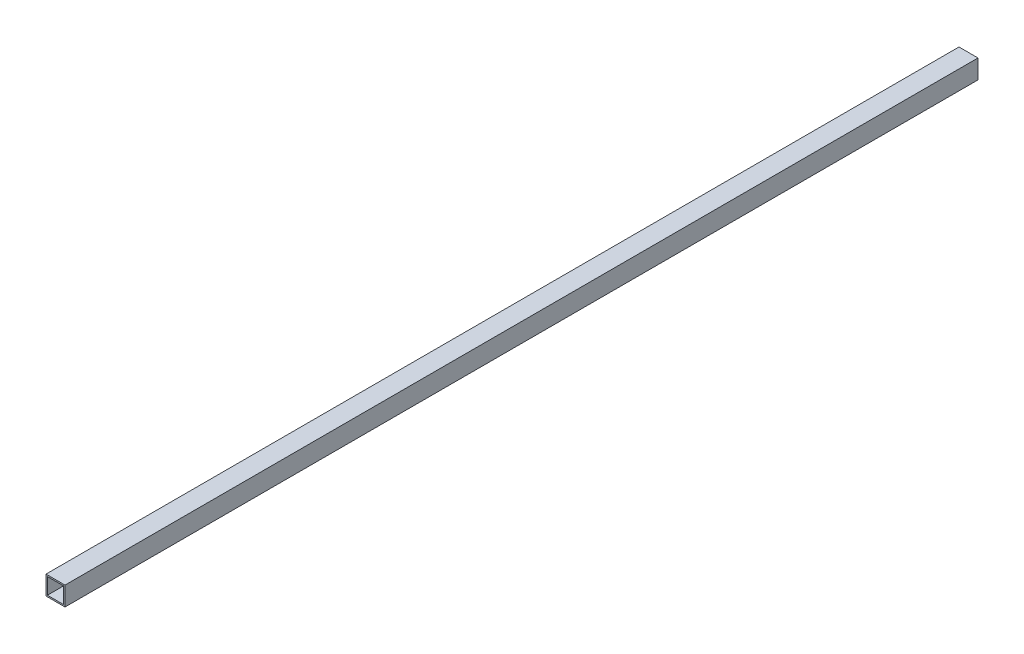
ISO-10303-21;
HEADER;
FILE_DESCRIPTION(('STEP AP214'),'2;1');
FILE_NAME('part.step','',(''),(''),'','','');
FILE_SCHEMA(('AUTOMOTIVE_DESIGN { 1 0 10303 214 1 1 1 1 }'));
ENDSEC;
DATA;
#1=APPLICATION_CONTEXT('core data for automotive mechanical design processes');
#2=APPLICATION_PROTOCOL_DEFINITION('international standard','automotive_design',2000,#1);
#3=PRODUCT_CONTEXT('',#1,'mechanical');
#4=PRODUCT('Part','Part','',(#3));
#5=PRODUCT_RELATED_PRODUCT_CATEGORY('part','',(#4));
#6=PRODUCT_DEFINITION_FORMATION('','',#4);
#7=PRODUCT_DEFINITION_CONTEXT('part definition',#1,'design');
#8=PRODUCT_DEFINITION('design','',#6,#7);
#9=PRODUCT_DEFINITION_SHAPE('','',#8);
#10=(LENGTH_UNIT() NAMED_UNIT(*) SI_UNIT(.MILLI.,.METRE.));
#11=(NAMED_UNIT(*) PLANE_ANGLE_UNIT() SI_UNIT($,.RADIAN.));
#12=(NAMED_UNIT(*) SI_UNIT($,.STERADIAN.) SOLID_ANGLE_UNIT());
#13=UNCERTAINTY_MEASURE_WITH_UNIT(LENGTH_MEASURE(1.E-05),#10,'distance_accuracy_value','');
#14=(GEOMETRIC_REPRESENTATION_CONTEXT(3) GLOBAL_UNCERTAINTY_ASSIGNED_CONTEXT((#13)) GLOBAL_UNIT_ASSIGNED_CONTEXT((#10,
#11,#12)) REPRESENTATION_CONTEXT('',''));
#15=CARTESIAN_POINT('',(0.,0.,0.));
#16=DIRECTION('',(0.,0.,1.));
#17=DIRECTION('',(1.,0.,0.));
#18=AXIS2_PLACEMENT_3D('',#15,#16,#17);
#19=CARTESIAN_POINT('',(20.,20.,1920.));
#20=DIRECTION('',(-1.,0.,0.));
#21=DIRECTION('',(0.,-1.,0.));
#22=AXIS2_PLACEMENT_3D('',#19,#20,#21);
#23=PLANE('',#22);
#24=DIRECTION('',(0.,1.,0.));
#25=VECTOR('',#24,1.);
#26=CARTESIAN_POINT('',(20.,20.,0.));
#27=LINE('',#26,#25);
#28=CARTESIAN_POINT('',(20.,-20.,0.));
#29=VERTEX_POINT('',#28);
#30=CARTESIAN_POINT('',(20.,20.,0.));
#31=VERTEX_POINT('',#30);
#32=EDGE_CURVE('E131',#29,#31,#27,.T.);
#33=ORIENTED_EDGE('',*,*,#32,.T.);
#34=DIRECTION('',(0.,0.,-1.));
#35=VECTOR('',#34,1.);
#36=CARTESIAN_POINT('',(20.,20.,1920.));
#37=LINE('',#36,#35);
#38=CARTESIAN_POINT('',(20.,20.,1920.));
#39=VERTEX_POINT('',#38);
#40=EDGE_CURVE('E11',#39,#31,#37,.T.);
#41=ORIENTED_EDGE('',*,*,#40,.F.);
#42=DIRECTION('',(0.,1.,0.));
#43=VECTOR('',#42,1.);
#44=CARTESIAN_POINT('',(20.,20.,1920.));
#45=LINE('',#44,#43);
#46=CARTESIAN_POINT('',(20.,-20.,1920.));
#47=VERTEX_POINT('',#46);
#48=EDGE_CURVE('E135',#47,#39,#45,.T.);
#49=ORIENTED_EDGE('',*,*,#48,.F.);
#50=DIRECTION('',(0.,0.,-1.));
#51=VECTOR('',#50,1.);
#52=CARTESIAN_POINT('',(20.,-20.,1920.));
#53=LINE('',#52,#51);
#54=EDGE_CURVE('E145',#47,#29,#53,.T.);
#55=ORIENTED_EDGE('',*,*,#54,.T.);
#56=EDGE_LOOP('',(#33,#41,#49,#55));
#57=FACE_BOUND('',#56,.T.);
#58=ADVANCED_FACE('F34',(#57),#23,.F.);
#59=CARTESIAN_POINT('',(-20.,20.,1920.));
#60=DIRECTION('',(0.,-1.,0.));
#61=DIRECTION('',(0.,0.,-1.));
#62=AXIS2_PLACEMENT_3D('',#59,#60,#61);
#63=PLANE('',#62);
#64=DIRECTION('',(-1.,0.,0.));
#65=VECTOR('',#64,1.);
#66=CARTESIAN_POINT('',(-20.,20.,0.));
#67=LINE('',#66,#65);
#68=CARTESIAN_POINT('',(-20.,20.,0.));
#69=VERTEX_POINT('',#68);
#70=EDGE_CURVE('E148',#31,#69,#67,.T.);
#71=ORIENTED_EDGE('',*,*,#70,.T.);
#72=DIRECTION('',(0.,0.,-1.));
#73=VECTOR('',#72,1.);
#74=CARTESIAN_POINT('',(-20.,20.,1920.));
#75=LINE('',#74,#73);
#76=CARTESIAN_POINT('',(-20.,20.,1920.));
#77=VERTEX_POINT('',#76);
#78=EDGE_CURVE('E41',#77,#69,#75,.T.);
#79=ORIENTED_EDGE('',*,*,#78,.F.);
#80=DIRECTION('',(-1.,0.,0.));
#81=VECTOR('',#80,1.);
#82=CARTESIAN_POINT('',(-20.,20.,1920.));
#83=LINE('',#82,#81);
#84=EDGE_CURVE('E138',#39,#77,#83,.T.);
#85=ORIENTED_EDGE('',*,*,#84,.F.);
#86=ORIENTED_EDGE('',*,*,#40,.T.);
#87=EDGE_LOOP('',(#71,#79,#85,#86));
#88=FACE_BOUND('',#87,.T.);
#89=ADVANCED_FACE('F176',(#88),#63,.F.);
#90=CARTESIAN_POINT('',(-20.,20.,1920.));
#91=DIRECTION('',(1.,0.,0.));
#92=DIRECTION('',(0.,0.,-1.));
#93=AXIS2_PLACEMENT_3D('',#90,#91,#92);
#94=PLANE('',#93);
#95=DIRECTION('',(0.,-1.,0.));
#96=VECTOR('',#95,1.);
#97=CARTESIAN_POINT('',(-20.,20.,0.));
#98=LINE('',#97,#96);
#99=CARTESIAN_POINT('',(-20.,-20.,0.));
#100=VERTEX_POINT('',#99);
#101=EDGE_CURVE('E150',#69,#100,#98,.T.);
#102=ORIENTED_EDGE('',*,*,#101,.T.);
#103=DIRECTION('',(0.,0.,-1.));
#104=VECTOR('',#103,1.);
#105=CARTESIAN_POINT('',(-20.,-20.,1920.));
#106=LINE('',#105,#104);
#107=CARTESIAN_POINT('',(-20.,-20.,1920.));
#108=VERTEX_POINT('',#107);
#109=EDGE_CURVE('E155',#108,#100,#106,.T.);
#110=ORIENTED_EDGE('',*,*,#109,.F.);
#111=DIRECTION('',(0.,-1.,0.));
#112=VECTOR('',#111,1.);
#113=CARTESIAN_POINT('',(-20.,20.,1920.));
#114=LINE('',#113,#112);
#115=EDGE_CURVE('E141',#77,#108,#114,.T.);
#116=ORIENTED_EDGE('',*,*,#115,.F.);
#117=ORIENTED_EDGE('',*,*,#78,.T.);
#118=EDGE_LOOP('',(#102,#110,#116,#117));
#119=FACE_BOUND('',#118,.T.);
#120=ADVANCED_FACE('F162',(#119),#94,.F.);
#121=CARTESIAN_POINT('',(-20.,-20.,1920.));
#122=DIRECTION('',(0.,1.,0.));
#123=DIRECTION('',(0.,0.,1.));
#124=AXIS2_PLACEMENT_3D('',#121,#122,#123);
#125=PLANE('',#124);
#126=DIRECTION('',(1.,0.,0.));
#127=VECTOR('',#126,1.);
#128=CARTESIAN_POINT('',(-20.,-20.,0.));
#129=LINE('',#128,#127);
#130=EDGE_CURVE('E139',#100,#29,#129,.T.);
#131=ORIENTED_EDGE('',*,*,#130,.T.);
#132=ORIENTED_EDGE('',*,*,#54,.F.);
#133=DIRECTION('',(1.,0.,0.));
#134=VECTOR('',#133,1.);
#135=CARTESIAN_POINT('',(-20.,-20.,1920.));
#136=LINE('',#135,#134);
#137=EDGE_CURVE('E143',#108,#47,#136,.T.);
#138=ORIENTED_EDGE('',*,*,#137,.F.);
#139=ORIENTED_EDGE('',*,*,#109,.T.);
#140=EDGE_LOOP('',(#131,#132,#138,#139));
#141=FACE_BOUND('',#140,.T.);
#142=ADVANCED_FACE('F171',(#141),#125,.F.);
#143=CARTESIAN_POINT('',(0.,0.,1920.));
#144=DIRECTION('',(0.,0.,1.));
#145=DIRECTION('',(1.,0.,0.));
#146=AXIS2_PLACEMENT_3D('',#143,#144,#145);
#147=PLANE('',#146);
#148=DIRECTION('',(0.,1.,0.));
#149=VECTOR('',#148,1.);
#150=CARTESIAN_POINT('',(-17.,17.,1920.));
#151=LINE('',#150,#149);
#152=CARTESIAN_POINT('',(-17.,-17.,1920.));
#153=VERTEX_POINT('',#152);
#154=CARTESIAN_POINT('',(-17.,17.,1920.));
#155=VERTEX_POINT('',#154);
#156=EDGE_CURVE('E100',#153,#155,#151,.T.);
#157=ORIENTED_EDGE('',*,*,#156,.T.);
#158=DIRECTION('',(1.,0.,0.));
#159=VECTOR('',#158,1.);
#160=CARTESIAN_POINT('',(17.,17.,1920.));
#161=LINE('',#160,#159);
#162=CARTESIAN_POINT('',(17.,17.,1920.));
#163=VERTEX_POINT('',#162);
#164=EDGE_CURVE('E109',#155,#163,#161,.T.);
#165=ORIENTED_EDGE('',*,*,#164,.T.);
#166=DIRECTION('',(0.,-1.,0.));
#167=VECTOR('',#166,1.);
#168=CARTESIAN_POINT('',(17.,17.,1920.));
#169=LINE('',#168,#167);
#170=CARTESIAN_POINT('',(17.,-17.,1920.));
#171=VERTEX_POINT('',#170);
#172=EDGE_CURVE('E48',#163,#171,#169,.T.);
#173=ORIENTED_EDGE('',*,*,#172,.T.);
#174=DIRECTION('',(-1.,0.,0.));
#175=VECTOR('',#174,1.);
#176=CARTESIAN_POINT('',(17.,-17.,1920.));
#177=LINE('',#176,#175);
#178=EDGE_CURVE('E106',#171,#153,#177,.T.);
#179=ORIENTED_EDGE('',*,*,#178,.T.);
#180=EDGE_LOOP('',(#157,#165,#173,#179));
#181=FACE_BOUND('',#180,.T.);
#182=ORIENTED_EDGE('',*,*,#48,.T.);
#183=ORIENTED_EDGE('',*,*,#84,.T.);
#184=ORIENTED_EDGE('',*,*,#115,.T.);
#185=ORIENTED_EDGE('',*,*,#137,.T.);
#186=EDGE_LOOP('',(#182,#183,#184,#185));
#187=FACE_BOUND('',#186,.T.);
#188=ADVANCED_FACE('F113',(#181,#187),#147,.T.);
#189=CARTESIAN_POINT('',(0.,0.,0.));
#190=DIRECTION('',(0.,0.,1.));
#191=DIRECTION('',(1.,0.,0.));
#192=AXIS2_PLACEMENT_3D('',#189,#190,#191);
#193=PLANE('',#192);
#194=DIRECTION('',(1.,0.,0.));
#195=VECTOR('',#194,1.);
#196=CARTESIAN_POINT('',(17.,17.,0.));
#197=LINE('',#196,#195);
#198=CARTESIAN_POINT('',(-17.,17.,0.));
#199=VERTEX_POINT('',#198);
#200=CARTESIAN_POINT('',(17.,17.,0.));
#201=VERTEX_POINT('',#200);
#202=EDGE_CURVE('E125',#199,#201,#197,.T.);
#203=ORIENTED_EDGE('',*,*,#202,.F.);
#204=DIRECTION('',(0.,1.,0.));
#205=VECTOR('',#204,1.);
#206=CARTESIAN_POINT('',(-17.,17.,0.));
#207=LINE('',#206,#205);
#208=CARTESIAN_POINT('',(-17.,-17.,0.));
#209=VERTEX_POINT('',#208);
#210=EDGE_CURVE('E56',#209,#199,#207,.T.);
#211=ORIENTED_EDGE('',*,*,#210,.F.);
#212=DIRECTION('',(-1.,0.,0.));
#213=VECTOR('',#212,1.);
#214=CARTESIAN_POINT('',(17.,-17.,0.));
#215=LINE('',#214,#213);
#216=CARTESIAN_POINT('',(17.,-17.,0.));
#217=VERTEX_POINT('',#216);
#218=EDGE_CURVE('E116',#217,#209,#215,.T.);
#219=ORIENTED_EDGE('',*,*,#218,.F.);
#220=DIRECTION('',(0.,-1.,0.));
#221=VECTOR('',#220,1.);
#222=CARTESIAN_POINT('',(17.,17.,0.));
#223=LINE('',#222,#221);
#224=EDGE_CURVE('E119',#201,#217,#223,.T.);
#225=ORIENTED_EDGE('',*,*,#224,.F.);
#226=EDGE_LOOP('',(#203,#211,#219,#225));
#227=FACE_BOUND('',#226,.T.);
#228=ORIENTED_EDGE('',*,*,#32,.F.);
#229=ORIENTED_EDGE('',*,*,#130,.F.);
#230=ORIENTED_EDGE('',*,*,#101,.F.);
#231=ORIENTED_EDGE('',*,*,#70,.F.);
#232=EDGE_LOOP('',(#228,#229,#230,#231));
#233=FACE_BOUND('',#232,.T.);
#234=ADVANCED_FACE('F168',(#227,#233),#193,.F.);
#235=CARTESIAN_POINT('',(-17.,17.,1920.));
#236=DIRECTION('',(-1.,0.,0.));
#237=DIRECTION('',(0.,-1.,0.));
#238=AXIS2_PLACEMENT_3D('',#235,#236,#237);
#239=PLANE('',#238);
#240=ORIENTED_EDGE('',*,*,#210,.T.);
#241=DIRECTION('',(0.,0.,-1.));
#242=VECTOR('',#241,1.);
#243=CARTESIAN_POINT('',(-17.,17.,1920.));
#244=LINE('',#243,#242);
#245=EDGE_CURVE('E96',#155,#199,#244,.T.);
#246=ORIENTED_EDGE('',*,*,#245,.F.);
#247=ORIENTED_EDGE('',*,*,#156,.F.);
#248=DIRECTION('',(0.,0.,-1.));
#249=VECTOR('',#248,1.);
#250=CARTESIAN_POINT('',(-17.,-17.,1920.));
#251=LINE('',#250,#249);
#252=EDGE_CURVE('E129',#153,#209,#251,.T.);
#253=ORIENTED_EDGE('',*,*,#252,.T.);
#254=EDGE_LOOP('',(#240,#246,#247,#253));
#255=FACE_BOUND('',#254,.T.);
#256=ADVANCED_FACE('F98',(#255),#239,.F.);
#257=CARTESIAN_POINT('',(17.,-17.,1920.));
#258=DIRECTION('',(0.,-1.,0.));
#259=DIRECTION('',(0.,0.,-1.));
#260=AXIS2_PLACEMENT_3D('',#257,#258,#259);
#261=PLANE('',#260);
#262=ORIENTED_EDGE('',*,*,#218,.T.);
#263=ORIENTED_EDGE('',*,*,#252,.F.);
#264=ORIENTED_EDGE('',*,*,#178,.F.);
#265=DIRECTION('',(0.,0.,-1.));
#266=VECTOR('',#265,1.);
#267=CARTESIAN_POINT('',(17.,-17.,1920.));
#268=LINE('',#267,#266);
#269=EDGE_CURVE('E132',#171,#217,#268,.T.);
#270=ORIENTED_EDGE('',*,*,#269,.T.);
#271=EDGE_LOOP('',(#262,#263,#264,#270));
#272=FACE_BOUND('',#271,.T.);
#273=ADVANCED_FACE('F193',(#272),#261,.F.);
#274=CARTESIAN_POINT('',(17.,17.,1920.));
#275=DIRECTION('',(1.,0.,0.));
#276=DIRECTION('',(0.,1.,0.));
#277=AXIS2_PLACEMENT_3D('',#274,#275,#276);
#278=PLANE('',#277);
#279=ORIENTED_EDGE('',*,*,#224,.T.);
#280=ORIENTED_EDGE('',*,*,#269,.F.);
#281=ORIENTED_EDGE('',*,*,#172,.F.);
#282=DIRECTION('',(0.,0.,-1.));
#283=VECTOR('',#282,1.);
#284=CARTESIAN_POINT('',(17.,17.,1920.));
#285=LINE('',#284,#283);
#286=EDGE_CURVE('E105',#163,#201,#285,.T.);
#287=ORIENTED_EDGE('',*,*,#286,.T.);
#288=EDGE_LOOP('',(#279,#280,#281,#287));
#289=FACE_BOUND('',#288,.T.);
#290=ADVANCED_FACE('F196',(#289),#278,.F.);
#291=CARTESIAN_POINT('',(17.,17.,1920.));
#292=DIRECTION('',(0.,1.,0.));
#293=DIRECTION('',(0.,0.,1.));
#294=AXIS2_PLACEMENT_3D('',#291,#292,#293);
#295=PLANE('',#294);
#296=ORIENTED_EDGE('',*,*,#202,.T.);
#297=ORIENTED_EDGE('',*,*,#286,.F.);
#298=ORIENTED_EDGE('',*,*,#164,.F.);
#299=ORIENTED_EDGE('',*,*,#245,.T.);
#300=EDGE_LOOP('',(#296,#297,#298,#299));
#301=FACE_BOUND('',#300,.T.);
#302=ADVANCED_FACE('F110',(#301),#295,.F.);
#303=CLOSED_SHELL('',(#58,#89,#120,#142,#188,#234,#256,#273,#290,#302));
#304=MANIFOLD_SOLID_BREP('B2',#303);
#305=ADVANCED_BREP_SHAPE_REPRESENTATION('',(#18,#304),#14);
#306=SHAPE_DEFINITION_REPRESENTATION(#9,#305);
ENDSEC;
END-ISO-10303-21;
